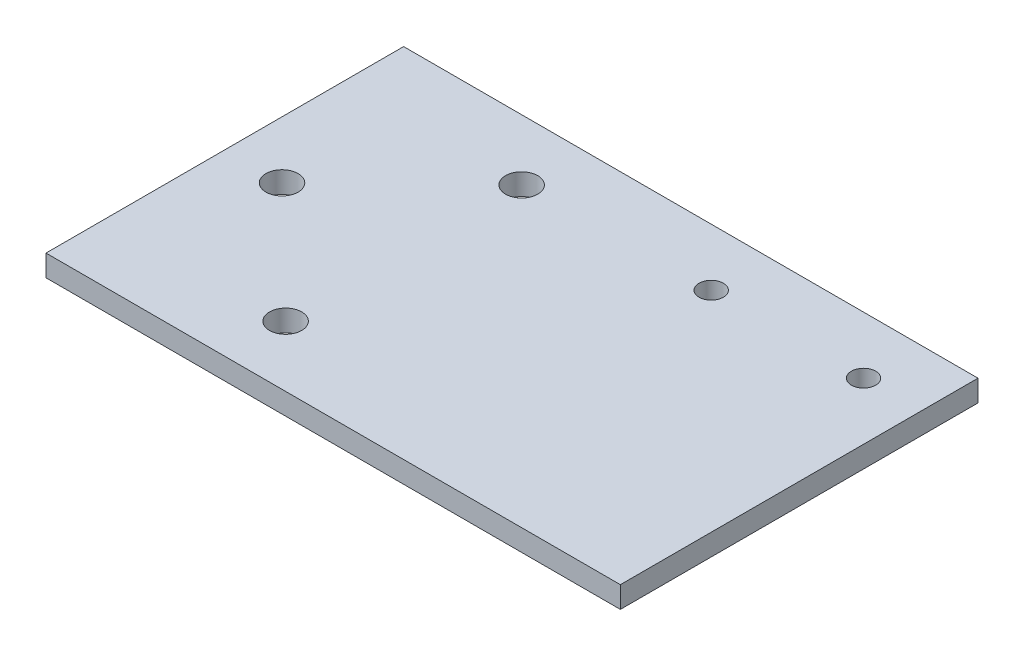
ISO-10303-21;
HEADER;
FILE_DESCRIPTION(('STEP AP214'),'2;1');
FILE_NAME('part.step','',(''),(''),'','','');
FILE_SCHEMA(('AUTOMOTIVE_DESIGN { 1 0 10303 214 1 1 1 1 }'));
ENDSEC;
DATA;
#1=APPLICATION_CONTEXT('core data for automotive mechanical design processes');
#2=APPLICATION_PROTOCOL_DEFINITION('international standard','automotive_design',2000,#1);
#3=PRODUCT_CONTEXT('',#1,'mechanical');
#4=PRODUCT('Part','Part','',(#3));
#5=PRODUCT_RELATED_PRODUCT_CATEGORY('part','',(#4));
#6=PRODUCT_DEFINITION_FORMATION('','',#4);
#7=PRODUCT_DEFINITION_CONTEXT('part definition',#1,'design');
#8=PRODUCT_DEFINITION('design','',#6,#7);
#9=PRODUCT_DEFINITION_SHAPE('','',#8);
#10=(LENGTH_UNIT() NAMED_UNIT(*) SI_UNIT(.MILLI.,.METRE.));
#11=(NAMED_UNIT(*) PLANE_ANGLE_UNIT() SI_UNIT($,.RADIAN.));
#12=(NAMED_UNIT(*) SI_UNIT($,.STERADIAN.) SOLID_ANGLE_UNIT());
#13=UNCERTAINTY_MEASURE_WITH_UNIT(LENGTH_MEASURE(1.E-05),#10,'distance_accuracy_value','');
#14=(GEOMETRIC_REPRESENTATION_CONTEXT(3) GLOBAL_UNCERTAINTY_ASSIGNED_CONTEXT((#13)) GLOBAL_UNIT_ASSIGNED_CONTEXT((#10,
#11,#12)) REPRESENTATION_CONTEXT('',''));
#15=CARTESIAN_POINT('',(0.,0.,0.));
#16=DIRECTION('',(0.,0.,1.));
#17=DIRECTION('',(1.,0.,0.));
#18=AXIS2_PLACEMENT_3D('',#15,#16,#17);
#19=CARTESIAN_POINT('',(0.,3.,0.));
#20=DIRECTION('',(0.,-1.,0.));
#21=DIRECTION('',(0.,0.,-1.));
#22=AXIS2_PLACEMENT_3D('',#19,#20,#21);
#23=PLANE('',#22);
#24=DIRECTION('',(0.,0.,1.));
#25=VECTOR('',#24,1.);
#26=CARTESIAN_POINT('',(0.,3.,0.));
#27=LINE('',#26,#25);
#28=CARTESIAN_POINT('',(0.,3.,-50.));
#29=VERTEX_POINT('',#28);
#30=CARTESIAN_POINT('',(0.,3.,0.));
#31=VERTEX_POINT('',#30);
#32=EDGE_CURVE('E88',#29,#31,#27,.T.);
#33=ORIENTED_EDGE('',*,*,#32,.T.);
#34=DIRECTION('',(1.,0.,0.));
#35=VECTOR('',#34,1.);
#36=CARTESIAN_POINT('',(0.,3.,0.));
#37=LINE('',#36,#35);
#38=CARTESIAN_POINT('',(80.3,3.,0.));
#39=VERTEX_POINT('',#38);
#40=EDGE_CURVE('E83',#31,#39,#37,.T.);
#41=ORIENTED_EDGE('',*,*,#40,.T.);
#42=DIRECTION('',(0.,0.,-1.));
#43=VECTOR('',#42,1.);
#44=CARTESIAN_POINT('',(80.3,3.,0.));
#45=LINE('',#44,#43);
#46=CARTESIAN_POINT('',(80.3,3.,-50.));
#47=VERTEX_POINT('',#46);
#48=EDGE_CURVE('E86',#39,#47,#45,.T.);
#49=ORIENTED_EDGE('',*,*,#48,.T.);
#50=DIRECTION('',(-1.,0.,0.));
#51=VECTOR('',#50,1.);
#52=CARTESIAN_POINT('',(0.,3.,-50.));
#53=LINE('',#52,#51);
#54=EDGE_CURVE('E53',#47,#29,#53,.T.);
#55=ORIENTED_EDGE('',*,*,#54,.T.);
#56=EDGE_LOOP('',(#33,#41,#49,#55));
#57=FACE_BOUND('',#56,.T.);
#58=CARTESIAN_POINT('',(72.3,3.,-42.));
#59=DIRECTION('',(0.,1.,0.));
#60=DIRECTION('',(0.,0.,1.));
#61=AXIS2_PLACEMENT_3D('',#58,#59,#60);
#62=CIRCLE('',#61,1.7);
#63=CARTESIAN_POINT('',(72.3,3.,-40.3));
#64=VERTEX_POINT('',#63);
#65=EDGE_CURVE('E103',#64,#64,#62,.T.);
#66=ORIENTED_EDGE('',*,*,#65,.F.);
#67=EDGE_LOOP('',(#66));
#68=FACE_BOUND('',#67,.T.);
#69=CARTESIAN_POINT('',(51.,3.,-42.));
#70=DIRECTION('',(0.,1.,0.));
#71=DIRECTION('',(0.,0.,1.));
#72=AXIS2_PLACEMENT_3D('',#69,#70,#71);
#73=CIRCLE('',#72,1.7);
#74=CARTESIAN_POINT('',(51.,3.,-40.3));
#75=VERTEX_POINT('',#74);
#76=EDGE_CURVE('E118',#75,#75,#73,.T.);
#77=ORIENTED_EDGE('',*,*,#76,.F.);
#78=EDGE_LOOP('',(#77));
#79=FACE_BOUND('',#78,.T.);
#80=CARTESIAN_POINT('',(25.,3.,-8.5));
#81=DIRECTION('',(0.,1.,0.));
#82=DIRECTION('',(0.,0.,1.));
#83=AXIS2_PLACEMENT_3D('',#80,#81,#82);
#84=CIRCLE('',#83,2.25);
#85=CARTESIAN_POINT('',(25.,3.,-6.25));
#86=VERTEX_POINT('',#85);
#87=EDGE_CURVE('E124',#86,#86,#84,.T.);
#88=ORIENTED_EDGE('',*,*,#87,.F.);
#89=EDGE_LOOP('',(#88));
#90=FACE_BOUND('',#89,.T.);
#91=CARTESIAN_POINT('',(8.,3.,-25.));
#92=DIRECTION('',(0.,1.,0.));
#93=DIRECTION('',(0.,0.,1.));
#94=AXIS2_PLACEMENT_3D('',#91,#92,#93);
#95=CIRCLE('',#94,2.25);
#96=CARTESIAN_POINT('',(8.,3.,-22.75));
#97=VERTEX_POINT('',#96);
#98=EDGE_CURVE('E130',#97,#97,#95,.T.);
#99=ORIENTED_EDGE('',*,*,#98,.F.);
#100=EDGE_LOOP('',(#99));
#101=FACE_BOUND('',#100,.T.);
#102=CARTESIAN_POINT('',(25.,3.,-41.5));
#103=DIRECTION('',(0.,1.,0.));
#104=DIRECTION('',(0.,0.,1.));
#105=AXIS2_PLACEMENT_3D('',#102,#103,#104);
#106=CIRCLE('',#105,2.25);
#107=CARTESIAN_POINT('',(25.,3.,-39.25));
#108=VERTEX_POINT('',#107);
#109=EDGE_CURVE('E136',#108,#108,#106,.T.);
#110=ORIENTED_EDGE('',*,*,#109,.F.);
#111=EDGE_LOOP('',(#110));
#112=FACE_BOUND('',#111,.T.);
#113=ADVANCED_FACE('F36',(#57,#68,#79,#90,#101,#112),#23,.F.);
#114=CARTESIAN_POINT('',(0.,0.,0.));
#115=DIRECTION('',(0.,-1.,0.));
#116=DIRECTION('',(0.,0.,-1.));
#117=AXIS2_PLACEMENT_3D('',#114,#115,#116);
#118=PLANE('',#117);
#119=CARTESIAN_POINT('',(8.,0.,-25.));
#120=DIRECTION('',(0.,1.,0.));
#121=DIRECTION('',(0.,0.,1.));
#122=AXIS2_PLACEMENT_3D('',#119,#120,#121);
#123=CIRCLE('',#122,2.25);
#124=CARTESIAN_POINT('',(8.,0.,-22.75));
#125=VERTEX_POINT('',#124);
#126=EDGE_CURVE('E133',#125,#125,#123,.T.);
#127=ORIENTED_EDGE('',*,*,#126,.T.);
#128=EDGE_LOOP('',(#127));
#129=FACE_BOUND('',#128,.T.);
#130=CARTESIAN_POINT('',(51.,0.,-42.));
#131=DIRECTION('',(0.,1.,0.));
#132=DIRECTION('',(0.,0.,1.));
#133=AXIS2_PLACEMENT_3D('',#130,#131,#132);
#134=CIRCLE('',#133,1.7);
#135=CARTESIAN_POINT('',(51.,0.,-40.3));
#136=VERTEX_POINT('',#135);
#137=EDGE_CURVE('E121',#136,#136,#134,.T.);
#138=ORIENTED_EDGE('',*,*,#137,.T.);
#139=EDGE_LOOP('',(#138));
#140=FACE_BOUND('',#139,.T.);
#141=DIRECTION('',(0.,0.,1.));
#142=VECTOR('',#141,1.);
#143=CARTESIAN_POINT('',(0.,0.,0.));
#144=LINE('',#143,#142);
#145=CARTESIAN_POINT('',(0.,0.,-50.));
#146=VERTEX_POINT('',#145);
#147=CARTESIAN_POINT('',(0.,0.,0.));
#148=VERTEX_POINT('',#147);
#149=EDGE_CURVE('E100',#146,#148,#144,.T.);
#150=ORIENTED_EDGE('',*,*,#149,.F.);
#151=DIRECTION('',(-1.,0.,0.));
#152=VECTOR('',#151,1.);
#153=CARTESIAN_POINT('',(0.,0.,-50.));
#154=LINE('',#153,#152);
#155=CARTESIAN_POINT('',(80.3,0.,-50.));
#156=VERTEX_POINT('',#155);
#157=EDGE_CURVE('E76',#156,#146,#154,.T.);
#158=ORIENTED_EDGE('',*,*,#157,.F.);
#159=DIRECTION('',(0.,0.,-1.));
#160=VECTOR('',#159,1.);
#161=CARTESIAN_POINT('',(80.3,0.,0.));
#162=LINE('',#161,#160);
#163=CARTESIAN_POINT('',(80.3,0.,0.));
#164=VERTEX_POINT('',#163);
#165=EDGE_CURVE('E70',#164,#156,#162,.T.);
#166=ORIENTED_EDGE('',*,*,#165,.F.);
#167=DIRECTION('',(1.,0.,0.));
#168=VECTOR('',#167,1.);
#169=CARTESIAN_POINT('',(0.,0.,0.));
#170=LINE('',#169,#168);
#171=EDGE_CURVE('E92',#148,#164,#170,.T.);
#172=ORIENTED_EDGE('',*,*,#171,.F.);
#173=EDGE_LOOP('',(#150,#158,#166,#172));
#174=FACE_BOUND('',#173,.T.);
#175=CARTESIAN_POINT('',(72.3,0.,-42.));
#176=DIRECTION('',(0.,1.,0.));
#177=DIRECTION('',(0.,0.,1.));
#178=AXIS2_PLACEMENT_3D('',#175,#176,#177);
#179=CIRCLE('',#178,1.7);
#180=CARTESIAN_POINT('',(72.3,0.,-40.3));
#181=VERTEX_POINT('',#180);
#182=EDGE_CURVE('E115',#181,#181,#179,.T.);
#183=ORIENTED_EDGE('',*,*,#182,.T.);
#184=EDGE_LOOP('',(#183));
#185=FACE_BOUND('',#184,.T.);
#186=CARTESIAN_POINT('',(25.,0.,-8.5));
#187=DIRECTION('',(0.,1.,0.));
#188=DIRECTION('',(0.,0.,1.));
#189=AXIS2_PLACEMENT_3D('',#186,#187,#188);
#190=CIRCLE('',#189,2.25);
#191=CARTESIAN_POINT('',(25.,0.,-6.25));
#192=VERTEX_POINT('',#191);
#193=EDGE_CURVE('E127',#192,#192,#190,.T.);
#194=ORIENTED_EDGE('',*,*,#193,.T.);
#195=EDGE_LOOP('',(#194));
#196=FACE_BOUND('',#195,.T.);
#197=CARTESIAN_POINT('',(25.,0.,-41.5));
#198=DIRECTION('',(0.,1.,0.));
#199=DIRECTION('',(0.,0.,1.));
#200=AXIS2_PLACEMENT_3D('',#197,#198,#199);
#201=CIRCLE('',#200,2.25);
#202=CARTESIAN_POINT('',(25.,0.,-39.25));
#203=VERTEX_POINT('',#202);
#204=EDGE_CURVE('E139',#203,#203,#201,.T.);
#205=ORIENTED_EDGE('',*,*,#204,.T.);
#206=EDGE_LOOP('',(#205));
#207=FACE_BOUND('',#206,.T.);
#208=ADVANCED_FACE('F111',(#129,#140,#174,#185,#196,#207),#118,.T.);
#209=CARTESIAN_POINT('',(0.,3.,0.));
#210=DIRECTION('',(1.,0.,0.));
#211=DIRECTION('',(0.,0.,-1.));
#212=AXIS2_PLACEMENT_3D('',#209,#210,#211);
#213=PLANE('',#212);
#214=ORIENTED_EDGE('',*,*,#149,.T.);
#215=DIRECTION('',(0.,-1.,0.));
#216=VECTOR('',#215,1.);
#217=CARTESIAN_POINT('',(0.,3.,0.));
#218=LINE('',#217,#216);
#219=EDGE_CURVE('E11',#31,#148,#218,.T.);
#220=ORIENTED_EDGE('',*,*,#219,.F.);
#221=ORIENTED_EDGE('',*,*,#32,.F.);
#222=DIRECTION('',(0.,-1.,0.));
#223=VECTOR('',#222,1.);
#224=CARTESIAN_POINT('',(0.,3.,-50.));
#225=LINE('',#224,#223);
#226=EDGE_CURVE('E96',#29,#146,#225,.T.);
#227=ORIENTED_EDGE('',*,*,#226,.T.);
#228=EDGE_LOOP('',(#214,#220,#221,#227));
#229=FACE_BOUND('',#228,.T.);
#230=ADVANCED_FACE('F38',(#229),#213,.F.);
#231=CARTESIAN_POINT('',(0.,3.,0.));
#232=DIRECTION('',(0.,0.,-1.));
#233=DIRECTION('',(-1.,0.,0.));
#234=AXIS2_PLACEMENT_3D('',#231,#232,#233);
#235=PLANE('',#234);
#236=ORIENTED_EDGE('',*,*,#171,.T.);
#237=DIRECTION('',(0.,-1.,0.));
#238=VECTOR('',#237,1.);
#239=CARTESIAN_POINT('',(80.3,3.,0.));
#240=LINE('',#239,#238);
#241=EDGE_CURVE('E45',#39,#164,#240,.T.);
#242=ORIENTED_EDGE('',*,*,#241,.F.);
#243=ORIENTED_EDGE('',*,*,#40,.F.);
#244=ORIENTED_EDGE('',*,*,#219,.T.);
#245=EDGE_LOOP('',(#236,#242,#243,#244));
#246=FACE_BOUND('',#245,.T.);
#247=ADVANCED_FACE('F91',(#246),#235,.F.);
#248=CARTESIAN_POINT('',(80.3,3.,0.));
#249=DIRECTION('',(-1.,0.,0.));
#250=DIRECTION('',(0.,0.,1.));
#251=AXIS2_PLACEMENT_3D('',#248,#249,#250);
#252=PLANE('',#251);
#253=ORIENTED_EDGE('',*,*,#165,.T.);
#254=DIRECTION('',(0.,-1.,0.));
#255=VECTOR('',#254,1.);
#256=CARTESIAN_POINT('',(80.3,3.,-50.));
#257=LINE('',#256,#255);
#258=EDGE_CURVE('E93',#47,#156,#257,.T.);
#259=ORIENTED_EDGE('',*,*,#258,.F.);
#260=ORIENTED_EDGE('',*,*,#48,.F.);
#261=ORIENTED_EDGE('',*,*,#241,.T.);
#262=EDGE_LOOP('',(#253,#259,#260,#261));
#263=FACE_BOUND('',#262,.T.);
#264=ADVANCED_FACE('F94',(#263),#252,.F.);
#265=CARTESIAN_POINT('',(0.,3.,-50.));
#266=DIRECTION('',(0.,0.,1.));
#267=DIRECTION('',(1.,0.,0.));
#268=AXIS2_PLACEMENT_3D('',#265,#266,#267);
#269=PLANE('',#268);
#270=ORIENTED_EDGE('',*,*,#157,.T.);
#271=ORIENTED_EDGE('',*,*,#226,.F.);
#272=ORIENTED_EDGE('',*,*,#54,.F.);
#273=ORIENTED_EDGE('',*,*,#258,.T.);
#274=EDGE_LOOP('',(#270,#271,#272,#273));
#275=FACE_BOUND('',#274,.T.);
#276=ADVANCED_FACE('F108',(#275),#269,.F.);
#277=CARTESIAN_POINT('',(72.3,3.,-42.));
#278=DIRECTION('',(0.,-1.,0.));
#279=DIRECTION('',(0.,0.,-1.));
#280=AXIS2_PLACEMENT_3D('',#277,#278,#279);
#281=CYLINDRICAL_SURFACE('',#280,1.7);
#282=ORIENTED_EDGE('',*,*,#65,.T.);
#283=EDGE_LOOP('',(#282));
#284=FACE_BOUND('',#283,.T.);
#285=ORIENTED_EDGE('',*,*,#182,.F.);
#286=EDGE_LOOP('',(#285));
#287=FACE_BOUND('',#286,.T.);
#288=ADVANCED_FACE('F156',(#284,#287),#281,.F.);
#289=CARTESIAN_POINT('',(51.,3.,-42.));
#290=DIRECTION('',(0.,-1.,0.));
#291=DIRECTION('',(0.,0.,-1.));
#292=AXIS2_PLACEMENT_3D('',#289,#290,#291);
#293=CYLINDRICAL_SURFACE('',#292,1.7);
#294=ORIENTED_EDGE('',*,*,#76,.T.);
#295=EDGE_LOOP('',(#294));
#296=FACE_BOUND('',#295,.T.);
#297=ORIENTED_EDGE('',*,*,#137,.F.);
#298=EDGE_LOOP('',(#297));
#299=FACE_BOUND('',#298,.T.);
#300=ADVANCED_FACE('F202',(#296,#299),#293,.F.);
#301=CARTESIAN_POINT('',(25.,3.,-8.5));
#302=DIRECTION('',(0.,-1.,0.));
#303=DIRECTION('',(0.,0.,-1.));
#304=AXIS2_PLACEMENT_3D('',#301,#302,#303);
#305=CYLINDRICAL_SURFACE('',#304,2.25);
#306=ORIENTED_EDGE('',*,*,#87,.T.);
#307=EDGE_LOOP('',(#306));
#308=FACE_BOUND('',#307,.T.);
#309=ORIENTED_EDGE('',*,*,#193,.F.);
#310=EDGE_LOOP('',(#309));
#311=FACE_BOUND('',#310,.T.);
#312=ADVANCED_FACE('F210',(#308,#311),#305,.F.);
#313=CARTESIAN_POINT('',(8.,3.,-25.));
#314=DIRECTION('',(0.,-1.,0.));
#315=DIRECTION('',(0.,0.,-1.));
#316=AXIS2_PLACEMENT_3D('',#313,#314,#315);
#317=CYLINDRICAL_SURFACE('',#316,2.25);
#318=ORIENTED_EDGE('',*,*,#98,.T.);
#319=EDGE_LOOP('',(#318));
#320=FACE_BOUND('',#319,.T.);
#321=ORIENTED_EDGE('',*,*,#126,.F.);
#322=EDGE_LOOP('',(#321));
#323=FACE_BOUND('',#322,.T.);
#324=ADVANCED_FACE('F218',(#320,#323),#317,.F.);
#325=CARTESIAN_POINT('',(25.,3.,-41.5));
#326=DIRECTION('',(0.,-1.,0.));
#327=DIRECTION('',(0.,0.,-1.));
#328=AXIS2_PLACEMENT_3D('',#325,#326,#327);
#329=CYLINDRICAL_SURFACE('',#328,2.25);
#330=ORIENTED_EDGE('',*,*,#109,.T.);
#331=EDGE_LOOP('',(#330));
#332=FACE_BOUND('',#331,.T.);
#333=ORIENTED_EDGE('',*,*,#204,.F.);
#334=EDGE_LOOP('',(#333));
#335=FACE_BOUND('',#334,.T.);
#336=ADVANCED_FACE('F145',(#332,#335),#329,.F.);
#337=CLOSED_SHELL('',(#113,#208,#230,#247,#264,#276,#288,#300,#312,#324,#336));
#338=MANIFOLD_SOLID_BREP('B2',#337);
#339=ADVANCED_BREP_SHAPE_REPRESENTATION('',(#18,#338),#14);
#340=SHAPE_DEFINITION_REPRESENTATION(#9,#339);
ENDSEC;
END-ISO-10303-21;
